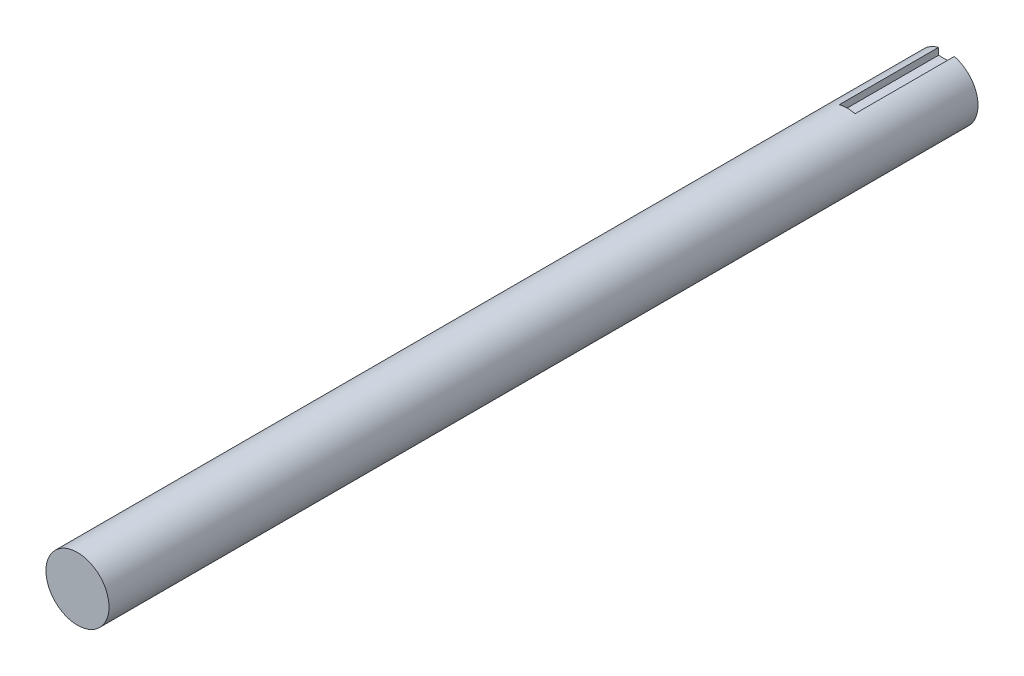
ISO-10303-21;
HEADER;
FILE_DESCRIPTION(('STEP AP214'),'2;1');
FILE_NAME('part.step','',(''),(''),'','','');
FILE_SCHEMA(('AUTOMOTIVE_DESIGN { 1 0 10303 214 1 1 1 1 }'));
ENDSEC;
DATA;
#1=APPLICATION_CONTEXT('core data for automotive mechanical design processes');
#2=APPLICATION_PROTOCOL_DEFINITION('international standard','automotive_design',2000,#1);
#3=PRODUCT_CONTEXT('',#1,'mechanical');
#4=PRODUCT('Part','Part','',(#3));
#5=PRODUCT_RELATED_PRODUCT_CATEGORY('part','',(#4));
#6=PRODUCT_DEFINITION_FORMATION('','',#4);
#7=PRODUCT_DEFINITION_CONTEXT('part definition',#1,'design');
#8=PRODUCT_DEFINITION('design','',#6,#7);
#9=PRODUCT_DEFINITION_SHAPE('','',#8);
#10=(LENGTH_UNIT() NAMED_UNIT(*) SI_UNIT(.MILLI.,.METRE.));
#11=(NAMED_UNIT(*) PLANE_ANGLE_UNIT() SI_UNIT($,.RADIAN.));
#12=(NAMED_UNIT(*) SI_UNIT($,.STERADIAN.) SOLID_ANGLE_UNIT());
#13=UNCERTAINTY_MEASURE_WITH_UNIT(LENGTH_MEASURE(1.E-05),#10,'distance_accuracy_value','');
#14=(GEOMETRIC_REPRESENTATION_CONTEXT(3) GLOBAL_UNCERTAINTY_ASSIGNED_CONTEXT((#13)) GLOBAL_UNIT_ASSIGNED_CONTEXT((#10,
#11,#12)) REPRESENTATION_CONTEXT('',''));
#15=CARTESIAN_POINT('',(0.,0.,0.));
#16=DIRECTION('',(0.,0.,1.));
#17=DIRECTION('',(1.,0.,0.));
#18=AXIS2_PLACEMENT_3D('',#15,#16,#17);
#19=CARTESIAN_POINT('',(-3.175,9.525,-150.));
#20=DIRECTION('',(0.,-1.,0.));
#21=DIRECTION('',(0.,0.,-1.));
#22=AXIS2_PLACEMENT_3D('',#19,#20,#21);
#23=PLANE('',#22);
#24=DIRECTION('',(0.,0.,1.));
#25=VECTOR('',#24,1.);
#26=CARTESIAN_POINT('',(-3.175,9.525,-150.));
#27=LINE('',#26,#25);
#28=CARTESIAN_POINT('',(-3.175,9.525,-190.));
#29=VERTEX_POINT('',#28);
#30=CARTESIAN_POINT('',(-3.175,9.525,-150.));
#31=VERTEX_POINT('',#30);
#32=EDGE_CURVE('E56',#29,#31,#27,.T.);
#33=ORIENTED_EDGE('',*,*,#32,.T.);
#34=DIRECTION('',(1.,0.,0.));
#35=VECTOR('',#34,1.);
#36=CARTESIAN_POINT('',(0.,9.525,-150.));
#37=LINE('',#36,#35);
#38=CARTESIAN_POINT('',(3.175,9.525,-150.));
#39=VERTEX_POINT('',#38);
#40=EDGE_CURVE('E65',#31,#39,#37,.T.);
#41=ORIENTED_EDGE('',*,*,#40,.T.);
#42=DIRECTION('',(0.,0.,1.));
#43=VECTOR('',#42,1.);
#44=CARTESIAN_POINT('',(3.175,9.525,-150.));
#45=LINE('',#44,#43);
#46=CARTESIAN_POINT('',(3.175,9.525,-190.));
#47=VERTEX_POINT('',#46);
#48=EDGE_CURVE('E67',#39,#47,#45,.F.);
#49=ORIENTED_EDGE('',*,*,#48,.T.);
#50=DIRECTION('',(-1.,0.,0.));
#51=VECTOR('',#50,1.);
#52=CARTESIAN_POINT('',(0.,9.525,-190.));
#53=LINE('',#52,#51);
#54=EDGE_CURVE('E90',#29,#47,#53,.F.);
#55=ORIENTED_EDGE('',*,*,#54,.F.);
#56=EDGE_LOOP('',(#33,#41,#49,#55));
#57=FACE_BOUND('',#56,.T.);
#58=ADVANCED_FACE('F17',(#57),#23,.F.);
#59=CARTESIAN_POINT('',(3.175,15.875,-150.));
#60=DIRECTION('',(1.,0.,0.));
#61=DIRECTION('',(0.,1.,0.));
#62=AXIS2_PLACEMENT_3D('',#59,#60,#61);
#63=PLANE('',#62);
#64=DIRECTION('',(0.,0.,1.));
#65=VECTOR('',#64,1.);
#66=CARTESIAN_POINT('',(3.175,12.2967221242086,155.));
#67=LINE('',#66,#65);
#68=CARTESIAN_POINT('',(3.175,12.2967221242086,-190.));
#69=VERTEX_POINT('',#68);
#70=CARTESIAN_POINT('',(3.175,12.2967221242086,-150.));
#71=VERTEX_POINT('',#70);
#72=EDGE_CURVE('E88',#69,#71,#67,.T.);
#73=ORIENTED_EDGE('',*,*,#72,.F.);
#74=DIRECTION('',(0.,1.,0.));
#75=VECTOR('',#74,1.);
#76=CARTESIAN_POINT('',(3.175,0.,-190.));
#77=LINE('',#76,#75);
#78=EDGE_CURVE('E75',#47,#69,#77,.T.);
#79=ORIENTED_EDGE('',*,*,#78,.F.);
#80=ORIENTED_EDGE('',*,*,#48,.F.);
#81=DIRECTION('',(0.,1.,0.));
#82=VECTOR('',#81,1.);
#83=CARTESIAN_POINT('',(3.175,0.,-150.));
#84=LINE('',#83,#82);
#85=EDGE_CURVE('E70',#39,#71,#84,.T.);
#86=ORIENTED_EDGE('',*,*,#85,.T.);
#87=EDGE_LOOP('',(#73,#79,#80,#86));
#88=FACE_BOUND('',#87,.T.);
#89=ADVANCED_FACE('F74',(#88),#63,.F.);
#90=CARTESIAN_POINT('',(0.,0.,-150.));
#91=DIRECTION('',(0.,0.,1.));
#92=DIRECTION('',(1.,0.,0.));
#93=AXIS2_PLACEMENT_3D('',#90,#91,#92);
#94=PLANE('',#93);
#95=ORIENTED_EDGE('',*,*,#85,.F.);
#96=ORIENTED_EDGE('',*,*,#40,.F.);
#97=DIRECTION('',(0.,-1.,0.));
#98=VECTOR('',#97,1.);
#99=CARTESIAN_POINT('',(-3.175,15.875,-150.));
#100=LINE('',#99,#98);
#101=CARTESIAN_POINT('',(-3.175,12.2967221242086,-150.));
#102=VERTEX_POINT('',#101);
#103=EDGE_CURVE('E35',#31,#102,#100,.F.);
#104=ORIENTED_EDGE('',*,*,#103,.T.);
#105=CARTESIAN_POINT('',(0.,0.,-150.));
#106=DIRECTION('',(0.,0.,1.));
#107=DIRECTION('',(1.,0.,0.));
#108=AXIS2_PLACEMENT_3D('',#105,#106,#107);
#109=CIRCLE('',#108,12.7);
#110=EDGE_CURVE('E20',#71,#102,#109,.T.);
#111=ORIENTED_EDGE('',*,*,#110,.F.);
#112=EDGE_LOOP('',(#95,#96,#104,#111));
#113=FACE_BOUND('',#112,.T.);
#114=ADVANCED_FACE('F78',(#113),#94,.F.);
#115=CARTESIAN_POINT('',(-3.175,15.875,-150.));
#116=DIRECTION('',(-1.,0.,0.));
#117=DIRECTION('',(0.,-1.,0.));
#118=AXIS2_PLACEMENT_3D('',#115,#116,#117);
#119=PLANE('',#118);
#120=ORIENTED_EDGE('',*,*,#103,.F.);
#121=ORIENTED_EDGE('',*,*,#32,.F.);
#122=DIRECTION('',(0.,1.,0.));
#123=VECTOR('',#122,1.);
#124=CARTESIAN_POINT('',(-3.175,0.,-190.));
#125=LINE('',#124,#123);
#126=CARTESIAN_POINT('',(-3.175,12.2967221242086,-190.));
#127=VERTEX_POINT('',#126);
#128=EDGE_CURVE('E99',#127,#29,#125,.F.);
#129=ORIENTED_EDGE('',*,*,#128,.F.);
#130=DIRECTION('',(0.,0.,1.));
#131=VECTOR('',#130,1.);
#132=CARTESIAN_POINT('',(-3.175,12.2967221242086,155.));
#133=LINE('',#132,#131);
#134=EDGE_CURVE('E91',#102,#127,#133,.F.);
#135=ORIENTED_EDGE('',*,*,#134,.F.);
#136=EDGE_LOOP('',(#120,#121,#129,#135));
#137=FACE_BOUND('',#136,.T.);
#138=ADVANCED_FACE('F111',(#137),#119,.F.);
#139=CARTESIAN_POINT('',(0.,0.,-190.));
#140=DIRECTION('',(0.,0.,-1.));
#141=DIRECTION('',(-1.,0.,0.));
#142=AXIS2_PLACEMENT_3D('',#139,#140,#141);
#143=PLANE('',#142);
#144=ORIENTED_EDGE('',*,*,#128,.T.);
#145=ORIENTED_EDGE('',*,*,#54,.T.);
#146=ORIENTED_EDGE('',*,*,#78,.T.);
#147=CARTESIAN_POINT('',(0.,0.,-190.));
#148=DIRECTION('',(0.,0.,1.));
#149=DIRECTION('',(1.,0.,0.));
#150=AXIS2_PLACEMENT_3D('',#147,#148,#149);
#151=CIRCLE('',#150,12.7);
#152=EDGE_CURVE('E26',#127,#69,#151,.T.);
#153=ORIENTED_EDGE('',*,*,#152,.F.);
#154=EDGE_LOOP('',(#144,#145,#146,#153));
#155=FACE_BOUND('',#154,.T.);
#156=ADVANCED_FACE('F108',(#155),#143,.T.);
#157=CARTESIAN_POINT('',(0.,0.,160.));
#158=DIRECTION('',(0.,0.,-1.));
#159=DIRECTION('',(-1.,0.,0.));
#160=AXIS2_PLACEMENT_3D('',#157,#158,#159);
#161=PLANE('',#160);
#162=CARTESIAN_POINT('',(0.,0.,160.));
#163=DIRECTION('',(0.,0.,1.));
#164=DIRECTION('',(1.,0.,0.));
#165=AXIS2_PLACEMENT_3D('',#162,#163,#164);
#166=CIRCLE('',#165,12.7);
#167=CARTESIAN_POINT('',(12.7,0.,160.));
#168=VERTEX_POINT('',#167);
#169=EDGE_CURVE('E11',#168,#168,#166,.F.);
#170=ORIENTED_EDGE('',*,*,#169,.F.);
#171=EDGE_LOOP('',(#170));
#172=FACE_BOUND('',#171,.T.);
#173=ADVANCED_FACE('F119',(#172),#161,.F.);
#174=CARTESIAN_POINT('',(0.,0.,155.));
#175=DIRECTION('',(0.,0.,1.));
#176=DIRECTION('',(1.,0.,0.));
#177=AXIS2_PLACEMENT_3D('',#174,#175,#176);
#178=CYLINDRICAL_SURFACE('',#177,12.7);
#179=ORIENTED_EDGE('',*,*,#134,.T.);
#180=ORIENTED_EDGE('',*,*,#152,.T.);
#181=ORIENTED_EDGE('',*,*,#72,.T.);
#182=ORIENTED_EDGE('',*,*,#110,.T.);
#183=EDGE_LOOP('',(#179,#180,#181,#182));
#184=FACE_BOUND('',#183,.T.);
#185=ORIENTED_EDGE('',*,*,#169,.T.);
#186=EDGE_LOOP('',(#185));
#187=FACE_BOUND('',#186,.T.);
#188=ADVANCED_FACE('F109',(#184,#187),#178,.T.);
#189=CLOSED_SHELL('',(#58,#89,#114,#138,#156,#173,#188));
#190=MANIFOLD_SOLID_BREP('B1',#189);
#191=ADVANCED_BREP_SHAPE_REPRESENTATION('',(#18,#190),#14);
#192=SHAPE_DEFINITION_REPRESENTATION(#9,#191);
ENDSEC;
END-ISO-10303-21;
